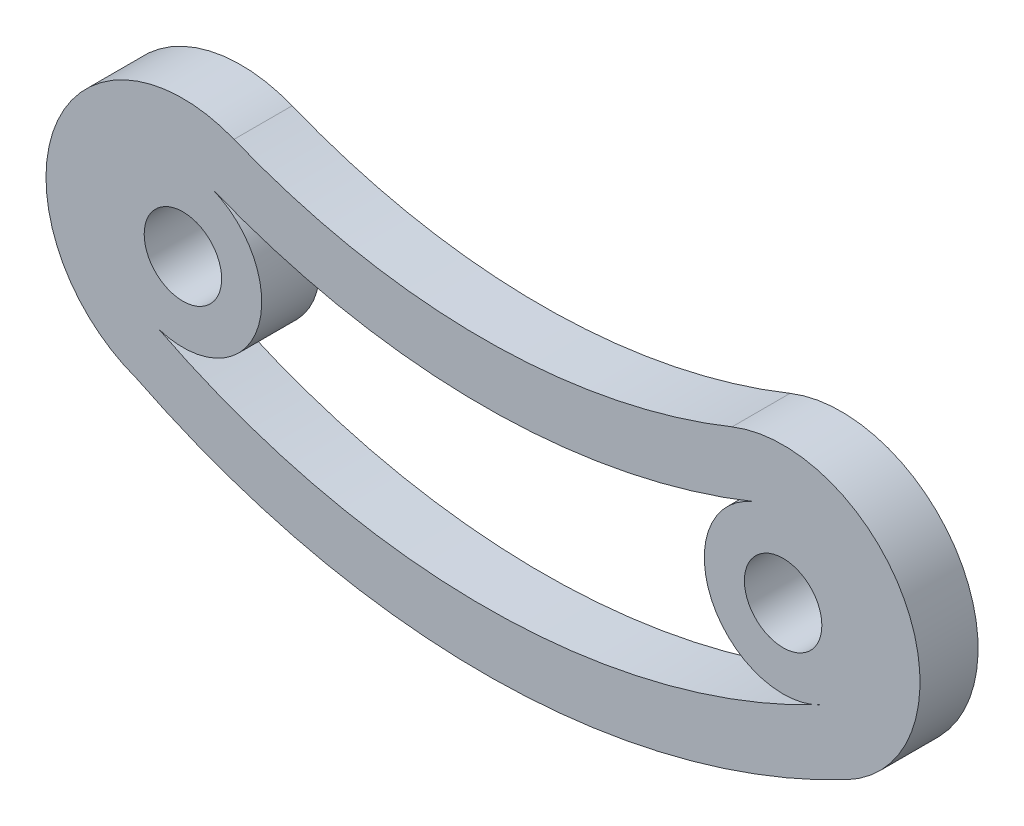
ISO-10303-21;
HEADER;
FILE_DESCRIPTION(('STEP AP214'),'2;1');
FILE_NAME('part.step','',(''),(''),'','','');
FILE_SCHEMA(('AUTOMOTIVE_DESIGN { 1 0 10303 214 1 1 1 1 }'));
ENDSEC;
DATA;
#1=APPLICATION_CONTEXT('core data for automotive mechanical design processes');
#2=APPLICATION_PROTOCOL_DEFINITION('international standard','automotive_design',2000,#1);
#3=PRODUCT_CONTEXT('',#1,'mechanical');
#4=PRODUCT('Part','Part','',(#3));
#5=PRODUCT_RELATED_PRODUCT_CATEGORY('part','',(#4));
#6=PRODUCT_DEFINITION_FORMATION('','',#4);
#7=PRODUCT_DEFINITION_CONTEXT('part definition',#1,'design');
#8=PRODUCT_DEFINITION('design','',#6,#7);
#9=PRODUCT_DEFINITION_SHAPE('','',#8);
#10=(LENGTH_UNIT() NAMED_UNIT(*) SI_UNIT(.MILLI.,.METRE.));
#11=(NAMED_UNIT(*) PLANE_ANGLE_UNIT() SI_UNIT($,.RADIAN.));
#12=(NAMED_UNIT(*) SI_UNIT($,.STERADIAN.) SOLID_ANGLE_UNIT());
#13=UNCERTAINTY_MEASURE_WITH_UNIT(LENGTH_MEASURE(1.E-05),#10,'distance_accuracy_value','');
#14=(GEOMETRIC_REPRESENTATION_CONTEXT(3) GLOBAL_UNCERTAINTY_ASSIGNED_CONTEXT((#13)) GLOBAL_UNIT_ASSIGNED_CONTEXT((#10,
#11,#12)) REPRESENTATION_CONTEXT('',''));
#15=CARTESIAN_POINT('',(0.,0.,0.));
#16=DIRECTION('',(0.,0.,1.));
#17=DIRECTION('',(1.,0.,0.));
#18=AXIS2_PLACEMENT_3D('',#15,#16,#17);
#19=CARTESIAN_POINT('',(15.5,-32.9667926412662,3.));
#20=DIRECTION('',(0.,0.,1.));
#21=DIRECTION('',(1.,0.,0.));
#22=AXIS2_PLACEMENT_3D('',#19,#20,#21);
#23=PLANE('',#22);
#24=CARTESIAN_POINT('',(0.,0.,3.));
#25=DIRECTION('',(0.,0.,1.));
#26=DIRECTION('',(1.,0.,0.));
#27=AXIS2_PLACEMENT_3D('',#24,#25,#26);
#28=CIRCLE('',#27,2.);
#29=CARTESIAN_POINT('',(2.,0.,3.));
#30=VERTEX_POINT('',#29);
#31=EDGE_CURVE('E382',#30,#30,#28,.T.);
#32=ORIENTED_EDGE('',*,*,#31,.F.);
#33=EDGE_LOOP('',(#32));
#34=FACE_BOUND('',#33,.T.);
#35=CARTESIAN_POINT('',(31.,0.,3.));
#36=DIRECTION('',(0.,0.,1.));
#37=DIRECTION('',(1.,0.,0.));
#38=AXIS2_PLACEMENT_3D('',#35,#36,#37);
#39=CIRCLE('',#38,2.);
#40=CARTESIAN_POINT('',(33.,0.,3.));
#41=VERTEX_POINT('',#40);
#42=EDGE_CURVE('E392',#41,#41,#39,.T.);
#43=ORIENTED_EDGE('',*,*,#42,.F.);
#44=EDGE_LOOP('',(#43));
#45=FACE_BOUND('',#44,.T.);
#46=CARTESIAN_POINT('',(0.,0.,3.));
#47=DIRECTION('',(0.,0.,-1.));
#48=DIRECTION('',(-1.,0.,0.));
#49=AXIS2_PLACEMENT_3D('',#46,#47,#48);
#50=CIRCLE('',#49,7.07106781186548);
#51=CARTESIAN_POINT('',(-2.39609766795524,-6.65272244766152,3.));
#52=VERTEX_POINT('',#51);
#53=CARTESIAN_POINT('',(2.63952486729692,6.55994729208408,3.));
#54=VERTEX_POINT('',#53);
#55=EDGE_CURVE('E250',#52,#54,#50,.T.);
#56=ORIENTED_EDGE('',*,*,#55,.F.);
#57=CARTESIAN_POINT('',(15.5623695477377,29.3844525517841,3.));
#58=DIRECTION('',(0.,0.,-1.));
#59=DIRECTION('',(-1.,0.,0.));
#60=AXIS2_PLACEMENT_3D('',#57,#58,#59);
#61=CIRCLE('',#60,40.2639358070941);
#62=CARTESIAN_POINT('',(34.2886742958806,-6.25976208618301,3.));
#63=VERTEX_POINT('',#62);
#64=EDGE_CURVE('E231',#52,#63,#61,.F.);
#65=ORIENTED_EDGE('',*,*,#64,.T.);
#66=CARTESIAN_POINT('',(31.,0.,3.));
#67=DIRECTION('',(0.,0.,-1.));
#68=DIRECTION('',(-1.,0.,0.));
#69=AXIS2_PLACEMENT_3D('',#66,#67,#68);
#70=CIRCLE('',#69,7.07106781186548);
#71=CARTESIAN_POINT('',(28.3604751327031,6.55994729208408,3.));
#72=VERTEX_POINT('',#71);
#73=EDGE_CURVE('E12',#72,#63,#70,.T.);
#74=ORIENTED_EDGE('',*,*,#73,.F.);
#75=CARTESIAN_POINT('',(15.5,38.5217749933269,3.));
#76=DIRECTION('',(0.,0.,-1.));
#77=DIRECTION('',(-1.,0.,0.));
#78=AXIS2_PLACEMENT_3D('',#75,#76,#77);
#79=CIRCLE('',#78,34.452144354783);
#80=EDGE_CURVE('E240',#54,#72,#79,.F.);
#81=ORIENTED_EDGE('',*,*,#80,.F.);
#82=EDGE_LOOP('',(#56,#65,#74,#81));
#83=FACE_BOUND('',#82,.T.);
#84=CARTESIAN_POINT('',(0.,0.,3.));
#85=DIRECTION('',(0.,0.,1.));
#86=DIRECTION('',(1.,0.,0.));
#87=AXIS2_PLACEMENT_3D('',#84,#85,#86);
#88=CIRCLE('',#87,4.07106781186548);
#89=CARTESIAN_POINT('',(-1.23316593848006,-3.87980603857716,3.));
#90=VERTEX_POINT('',#89);
#91=CARTESIAN_POINT('',(1.51966930763122,3.77679736340869,3.));
#92=VERTEX_POINT('',#91);
#93=EDGE_CURVE('E224',#90,#92,#88,.T.);
#94=ORIENTED_EDGE('',*,*,#93,.T.);
#95=CARTESIAN_POINT('',(15.5,38.5217749933269,3.));
#96=DIRECTION('',(0.,0.,1.));
#97=DIRECTION('',(1.,0.,0.));
#98=AXIS2_PLACEMENT_3D('',#95,#96,#97);
#99=CIRCLE('',#98,37.452144354783);
#100=CARTESIAN_POINT('',(29.4803306923688,3.77679736340869,3.));
#101=VERTEX_POINT('',#100);
#102=EDGE_CURVE('E227',#92,#101,#99,.T.);
#103=ORIENTED_EDGE('',*,*,#102,.T.);
#104=CARTESIAN_POINT('',(31.,0.,3.));
#105=DIRECTION('',(0.,0.,1.));
#106=DIRECTION('',(1.,0.,0.));
#107=AXIS2_PLACEMENT_3D('',#104,#105,#106);
#108=CIRCLE('',#107,4.07106781186548);
#109=CARTESIAN_POINT('',(32.893407958442,-3.60396995433033,3.));
#110=VERTEX_POINT('',#109);
#111=EDGE_CURVE('E219',#101,#110,#108,.T.);
#112=ORIENTED_EDGE('',*,*,#111,.T.);
#113=CARTESIAN_POINT('',(15.5623695477377,29.3844525517841,3.));
#114=DIRECTION('',(0.,0.,1.));
#115=DIRECTION('',(1.,0.,0.));
#116=AXIS2_PLACEMENT_3D('',#113,#114,#115);
#117=CIRCLE('',#116,37.2639358070941);
#118=EDGE_CURVE('E201',#90,#110,#117,.T.);
#119=ORIENTED_EDGE('',*,*,#118,.F.);
#120=EDGE_LOOP('',(#94,#103,#112,#119));
#121=FACE_BOUND('',#120,.T.);
#122=ADVANCED_FACE('F130',(#34,#45,#83,#121),#23,.T.);
#123=CARTESIAN_POINT('',(15.5,-32.9667926412662,0.));
#124=DIRECTION('',(0.,0.,1.));
#125=DIRECTION('',(1.,0.,0.));
#126=AXIS2_PLACEMENT_3D('',#123,#124,#125);
#127=PLANE('',#126);
#128=CARTESIAN_POINT('',(0.,0.,0.));
#129=DIRECTION('',(0.,0.,-1.));
#130=DIRECTION('',(-1.,0.,0.));
#131=AXIS2_PLACEMENT_3D('',#128,#129,#130);
#132=CIRCLE('',#131,2.);
#133=CARTESIAN_POINT('',(-2.,0.,0.));
#134=VERTEX_POINT('',#133);
#135=EDGE_CURVE('E385',#134,#134,#132,.T.);
#136=ORIENTED_EDGE('',*,*,#135,.F.);
#137=EDGE_LOOP('',(#136));
#138=FACE_BOUND('',#137,.T.);
#139=CARTESIAN_POINT('',(31.,0.,0.));
#140=DIRECTION('',(0.,0.,-1.));
#141=DIRECTION('',(-1.,0.,0.));
#142=AXIS2_PLACEMENT_3D('',#139,#140,#141);
#143=CIRCLE('',#142,2.);
#144=CARTESIAN_POINT('',(29.,0.,0.));
#145=VERTEX_POINT('',#144);
#146=EDGE_CURVE('E387',#145,#145,#143,.T.);
#147=ORIENTED_EDGE('',*,*,#146,.F.);
#148=EDGE_LOOP('',(#147));
#149=FACE_BOUND('',#148,.T.);
#150=CARTESIAN_POINT('',(15.5623695477377,29.3844525517841,0.));
#151=DIRECTION('',(0.,0.,-1.));
#152=DIRECTION('',(-1.,0.,0.));
#153=AXIS2_PLACEMENT_3D('',#150,#151,#152);
#154=CIRCLE('',#153,40.2639358070941);
#155=CARTESIAN_POINT('',(-2.39609766795524,-6.65272244766152,0.));
#156=VERTEX_POINT('',#155);
#157=CARTESIAN_POINT('',(34.2886742958806,-6.25976208618301,0.));
#158=VERTEX_POINT('',#157);
#159=EDGE_CURVE('E230',#156,#158,#154,.F.);
#160=ORIENTED_EDGE('',*,*,#159,.F.);
#161=CARTESIAN_POINT('',(0.,0.,0.));
#162=DIRECTION('',(0.,0.,-1.));
#163=DIRECTION('',(-1.,0.,0.));
#164=AXIS2_PLACEMENT_3D('',#161,#162,#163);
#165=CIRCLE('',#164,7.07106781186548);
#166=CARTESIAN_POINT('',(2.63952486729692,6.55994729208408,0.));
#167=VERTEX_POINT('',#166);
#168=EDGE_CURVE('E247',#156,#167,#165,.T.);
#169=ORIENTED_EDGE('',*,*,#168,.T.);
#170=CARTESIAN_POINT('',(15.5,38.5217749933269,0.));
#171=DIRECTION('',(0.,0.,-1.));
#172=DIRECTION('',(-1.,0.,0.));
#173=AXIS2_PLACEMENT_3D('',#170,#171,#172);
#174=CIRCLE('',#173,34.452144354783);
#175=CARTESIAN_POINT('',(28.3604751327031,6.55994729208408,0.));
#176=VERTEX_POINT('',#175);
#177=EDGE_CURVE('E238',#167,#176,#174,.F.);
#178=ORIENTED_EDGE('',*,*,#177,.T.);
#179=CARTESIAN_POINT('',(31.,0.,0.));
#180=DIRECTION('',(0.,0.,-1.));
#181=DIRECTION('',(-1.,0.,0.));
#182=AXIS2_PLACEMENT_3D('',#179,#180,#181);
#183=CIRCLE('',#182,7.07106781186548);
#184=EDGE_CURVE('E134',#176,#158,#183,.T.);
#185=ORIENTED_EDGE('',*,*,#184,.T.);
#186=EDGE_LOOP('',(#160,#169,#178,#185));
#187=FACE_BOUND('',#186,.T.);
#188=CARTESIAN_POINT('',(15.5,38.5217749933269,0.));
#189=DIRECTION('',(0.,0.,-1.));
#190=DIRECTION('',(-1.,0.,0.));
#191=AXIS2_PLACEMENT_3D('',#188,#189,#190);
#192=CIRCLE('',#191,37.452144354783);
#193=CARTESIAN_POINT('',(29.4803306923688,3.77679736340869,0.));
#194=VERTEX_POINT('',#193);
#195=CARTESIAN_POINT('',(1.51966930763122,3.77679736340869,0.));
#196=VERTEX_POINT('',#195);
#197=EDGE_CURVE('E153',#194,#196,#192,.T.);
#198=ORIENTED_EDGE('',*,*,#197,.T.);
#199=CARTESIAN_POINT('',(0.,0.,0.));
#200=DIRECTION('',(0.,0.,-1.));
#201=DIRECTION('',(-1.,0.,0.));
#202=AXIS2_PLACEMENT_3D('',#199,#200,#201);
#203=CIRCLE('',#202,4.07106781186548);
#204=CARTESIAN_POINT('',(-1.23316593848006,-3.87980603857716,0.));
#205=VERTEX_POINT('',#204);
#206=EDGE_CURVE('E212',#196,#205,#203,.T.);
#207=ORIENTED_EDGE('',*,*,#206,.T.);
#208=CARTESIAN_POINT('',(15.5623695477377,29.3844525517841,0.));
#209=DIRECTION('',(0.,0.,-1.));
#210=DIRECTION('',(-1.,0.,0.));
#211=AXIS2_PLACEMENT_3D('',#208,#209,#210);
#212=CIRCLE('',#211,37.2639358070941);
#213=CARTESIAN_POINT('',(32.893407958442,-3.60396995433033,0.));
#214=VERTEX_POINT('',#213);
#215=EDGE_CURVE('E198',#214,#205,#212,.T.);
#216=ORIENTED_EDGE('',*,*,#215,.F.);
#217=CARTESIAN_POINT('',(31.,0.,0.));
#218=DIRECTION('',(0.,0.,-1.));
#219=DIRECTION('',(-1.,0.,0.));
#220=AXIS2_PLACEMENT_3D('',#217,#218,#219);
#221=CIRCLE('',#220,4.07106781186548);
#222=EDGE_CURVE('E207',#214,#194,#221,.T.);
#223=ORIENTED_EDGE('',*,*,#222,.T.);
#224=EDGE_LOOP('',(#198,#207,#216,#223));
#225=FACE_BOUND('',#224,.T.);
#226=ADVANCED_FACE('F132',(#138,#149,#187,#225),#127,.F.);
#227=CARTESIAN_POINT('',(0.,0.,3.));
#228=DIRECTION('',(0.,0.,-1.));
#229=DIRECTION('',(-1.,0.,0.));
#230=AXIS2_PLACEMENT_3D('',#227,#228,#229);
#231=CYLINDRICAL_SURFACE('',#230,7.07106781186548);
#232=ORIENTED_EDGE('',*,*,#168,.F.);
#233=DIRECTION('',(0.,0.,-1.));
#234=VECTOR('',#233,1.);
#235=CARTESIAN_POINT('',(-2.39609766795524,-6.65272244766152,3.));
#236=LINE('',#235,#234);
#237=EDGE_CURVE('E233',#52,#156,#236,.T.);
#238=ORIENTED_EDGE('',*,*,#237,.F.);
#239=ORIENTED_EDGE('',*,*,#55,.T.);
#240=DIRECTION('',(0.,0.,-1.));
#241=VECTOR('',#240,1.);
#242=CARTESIAN_POINT('',(2.63952486729692,6.55994729208408,3.));
#243=LINE('',#242,#241);
#244=EDGE_CURVE('E242',#54,#167,#243,.T.);
#245=ORIENTED_EDGE('',*,*,#244,.T.);
#246=EDGE_LOOP('',(#232,#238,#239,#245));
#247=FACE_BOUND('',#246,.T.);
#248=ADVANCED_FACE('F265',(#247),#231,.T.);
#249=CARTESIAN_POINT('',(31.,0.,3.));
#250=DIRECTION('',(0.,0.,-1.));
#251=DIRECTION('',(-1.,0.,0.));
#252=AXIS2_PLACEMENT_3D('',#249,#250,#251);
#253=CYLINDRICAL_SURFACE('',#252,7.07106781186548);
#254=ORIENTED_EDGE('',*,*,#73,.T.);
#255=DIRECTION('',(0.,0.,-1.));
#256=VECTOR('',#255,1.);
#257=CARTESIAN_POINT('',(34.2886742958806,-6.25976208618301,3.));
#258=LINE('',#257,#256);
#259=EDGE_CURVE('E235',#63,#158,#258,.T.);
#260=ORIENTED_EDGE('',*,*,#259,.T.);
#261=ORIENTED_EDGE('',*,*,#184,.F.);
#262=DIRECTION('',(0.,0.,-1.));
#263=VECTOR('',#262,1.);
#264=CARTESIAN_POINT('',(28.3604751327031,6.55994729208408,3.));
#265=LINE('',#264,#263);
#266=EDGE_CURVE('E245',#72,#176,#265,.T.);
#267=ORIENTED_EDGE('',*,*,#266,.F.);
#268=EDGE_LOOP('',(#254,#260,#261,#267));
#269=FACE_BOUND('',#268,.T.);
#270=ADVANCED_FACE('F272',(#269),#253,.T.);
#271=CARTESIAN_POINT('',(15.5,38.5217749933269,3.));
#272=DIRECTION('',(0.,0.,-1.));
#273=DIRECTION('',(-1.,0.,0.));
#274=AXIS2_PLACEMENT_3D('',#271,#272,#273);
#275=CYLINDRICAL_SURFACE('',#274,34.452144354783);
#276=ORIENTED_EDGE('',*,*,#177,.F.);
#277=ORIENTED_EDGE('',*,*,#244,.F.);
#278=ORIENTED_EDGE('',*,*,#80,.T.);
#279=ORIENTED_EDGE('',*,*,#266,.T.);
#280=EDGE_LOOP('',(#276,#277,#278,#279));
#281=FACE_BOUND('',#280,.T.);
#282=ADVANCED_FACE('F262',(#281),#275,.F.);
#283=CARTESIAN_POINT('',(15.5623695477377,29.3844525517841,3.));
#284=DIRECTION('',(0.,0.,-1.));
#285=DIRECTION('',(-1.,0.,0.));
#286=AXIS2_PLACEMENT_3D('',#283,#284,#285);
#287=CYLINDRICAL_SURFACE('',#286,40.2639358070941);
#288=ORIENTED_EDGE('',*,*,#159,.T.);
#289=ORIENTED_EDGE('',*,*,#259,.F.);
#290=ORIENTED_EDGE('',*,*,#64,.F.);
#291=ORIENTED_EDGE('',*,*,#237,.T.);
#292=EDGE_LOOP('',(#288,#289,#290,#291));
#293=FACE_BOUND('',#292,.T.);
#294=ADVANCED_FACE('F274',(#293),#287,.T.);
#295=CARTESIAN_POINT('',(15.5,38.5217749933269,5.));
#296=DIRECTION('',(0.,0.,-1.));
#297=DIRECTION('',(-1.,0.,0.));
#298=AXIS2_PLACEMENT_3D('',#295,#296,#297);
#299=CYLINDRICAL_SURFACE('',#298,37.452144354783);
#300=DIRECTION('',(0.,0.,-1.));
#301=VECTOR('',#300,1.);
#302=CARTESIAN_POINT('',(1.51966930763122,3.77679736340869,5.));
#303=LINE('',#302,#301);
#304=EDGE_CURVE('E217',#92,#196,#303,.T.);
#305=ORIENTED_EDGE('',*,*,#304,.T.);
#306=ORIENTED_EDGE('',*,*,#197,.F.);
#307=DIRECTION('',(0.,0.,-1.));
#308=VECTOR('',#307,1.);
#309=CARTESIAN_POINT('',(29.4803306923688,3.77679736340869,5.));
#310=LINE('',#309,#308);
#311=EDGE_CURVE('E204',#101,#194,#310,.T.);
#312=ORIENTED_EDGE('',*,*,#311,.F.);
#313=ORIENTED_EDGE('',*,*,#102,.F.);
#314=EDGE_LOOP('',(#305,#306,#312,#313));
#315=FACE_BOUND('',#314,.T.);
#316=ADVANCED_FACE('F276',(#315),#299,.T.);
#317=CARTESIAN_POINT('',(0.,0.,5.));
#318=DIRECTION('',(0.,0.,-1.));
#319=DIRECTION('',(-1.,0.,0.));
#320=AXIS2_PLACEMENT_3D('',#317,#318,#319);
#321=CYLINDRICAL_SURFACE('',#320,4.07106781186548);
#322=DIRECTION('',(0.,0.,-1.));
#323=VECTOR('',#322,1.);
#324=CARTESIAN_POINT('',(-1.23316593848006,-3.87980603857716,5.));
#325=LINE('',#324,#323);
#326=EDGE_CURVE('E203',#90,#205,#325,.T.);
#327=ORIENTED_EDGE('',*,*,#326,.T.);
#328=ORIENTED_EDGE('',*,*,#206,.F.);
#329=ORIENTED_EDGE('',*,*,#304,.F.);
#330=ORIENTED_EDGE('',*,*,#93,.F.);
#331=EDGE_LOOP('',(#327,#328,#329,#330));
#332=FACE_BOUND('',#331,.T.);
#333=ADVANCED_FACE('F282',(#332),#321,.T.);
#334=CARTESIAN_POINT('',(15.5623695477377,29.3844525517841,5.));
#335=DIRECTION('',(0.,0.,-1.));
#336=DIRECTION('',(-1.,0.,0.));
#337=AXIS2_PLACEMENT_3D('',#334,#335,#336);
#338=CYLINDRICAL_SURFACE('',#337,37.2639358070941);
#339=ORIENTED_EDGE('',*,*,#118,.T.);
#340=DIRECTION('',(0.,0.,-1.));
#341=VECTOR('',#340,1.);
#342=CARTESIAN_POINT('',(32.893407958442,-3.60396995433033,5.));
#343=LINE('',#342,#341);
#344=EDGE_CURVE('E145',#110,#214,#343,.T.);
#345=ORIENTED_EDGE('',*,*,#344,.T.);
#346=ORIENTED_EDGE('',*,*,#215,.T.);
#347=ORIENTED_EDGE('',*,*,#326,.F.);
#348=EDGE_LOOP('',(#339,#345,#346,#347));
#349=FACE_BOUND('',#348,.T.);
#350=ADVANCED_FACE('F195',(#349),#338,.F.);
#351=CARTESIAN_POINT('',(31.,0.,5.));
#352=DIRECTION('',(0.,0.,-1.));
#353=DIRECTION('',(-1.,0.,0.));
#354=AXIS2_PLACEMENT_3D('',#351,#352,#353);
#355=CYLINDRICAL_SURFACE('',#354,4.07106781186548);
#356=ORIENTED_EDGE('',*,*,#311,.T.);
#357=ORIENTED_EDGE('',*,*,#222,.F.);
#358=ORIENTED_EDGE('',*,*,#344,.F.);
#359=ORIENTED_EDGE('',*,*,#111,.F.);
#360=EDGE_LOOP('',(#356,#357,#358,#359));
#361=FACE_BOUND('',#360,.T.);
#362=ADVANCED_FACE('F208',(#361),#355,.T.);
#363=CARTESIAN_POINT('',(31.,0.,5.));
#364=DIRECTION('',(0.,0.,-1.));
#365=DIRECTION('',(-1.,0.,0.));
#366=AXIS2_PLACEMENT_3D('',#363,#364,#365);
#367=CYLINDRICAL_SURFACE('',#366,2.);
#368=ORIENTED_EDGE('',*,*,#42,.T.);
#369=EDGE_LOOP('',(#368));
#370=FACE_BOUND('',#369,.T.);
#371=ORIENTED_EDGE('',*,*,#146,.T.);
#372=EDGE_LOOP('',(#371));
#373=FACE_BOUND('',#372,.T.);
#374=ADVANCED_FACE('F357',(#370,#373),#367,.F.);
#375=CARTESIAN_POINT('',(0.,0.,5.));
#376=DIRECTION('',(0.,0.,-1.));
#377=DIRECTION('',(-1.,0.,0.));
#378=AXIS2_PLACEMENT_3D('',#375,#376,#377);
#379=CYLINDRICAL_SURFACE('',#378,2.);
#380=ORIENTED_EDGE('',*,*,#31,.T.);
#381=EDGE_LOOP('',(#380));
#382=FACE_BOUND('',#381,.T.);
#383=ORIENTED_EDGE('',*,*,#135,.T.);
#384=EDGE_LOOP('',(#383));
#385=FACE_BOUND('',#384,.T.);
#386=ADVANCED_FACE('F366',(#382,#385),#379,.F.);
#387=CLOSED_SHELL('',(#122,#226,#248,#270,#282,#294,#316,#333,#350,#362,#374,#386));
#388=MANIFOLD_SOLID_BREP('B2',#387);
#389=ADVANCED_BREP_SHAPE_REPRESENTATION('',(#18,#388),#14);
#390=SHAPE_DEFINITION_REPRESENTATION(#9,#389);
ENDSEC;
END-ISO-10303-21;
